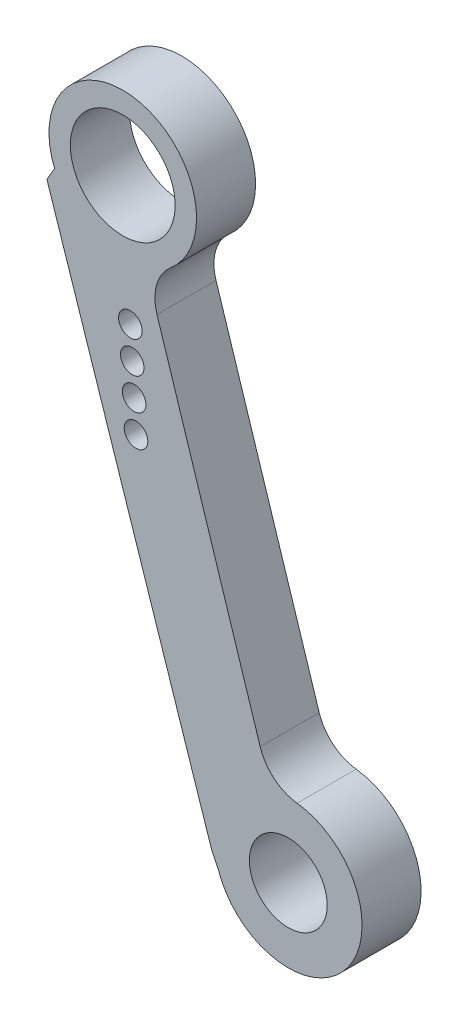
ISO-10303-21;
HEADER;
FILE_DESCRIPTION(('STEP AP214'),'2;1');
FILE_NAME('part.step','',(''),(''),'','','');
FILE_SCHEMA(('AUTOMOTIVE_DESIGN { 1 0 10303 214 1 1 1 1 }'));
ENDSEC;
DATA;
#1=APPLICATION_CONTEXT('core data for automotive mechanical design processes');
#2=APPLICATION_PROTOCOL_DEFINITION('international standard','automotive_design',2000,#1);
#3=PRODUCT_CONTEXT('',#1,'mechanical');
#4=PRODUCT('Part','Part','',(#3));
#5=PRODUCT_RELATED_PRODUCT_CATEGORY('part','',(#4));
#6=PRODUCT_DEFINITION_FORMATION('','',#4);
#7=PRODUCT_DEFINITION_CONTEXT('part definition',#1,'design');
#8=PRODUCT_DEFINITION('design','',#6,#7);
#9=PRODUCT_DEFINITION_SHAPE('','',#8);
#10=(LENGTH_UNIT() NAMED_UNIT(*) SI_UNIT(.MILLI.,.METRE.));
#11=(NAMED_UNIT(*) PLANE_ANGLE_UNIT() SI_UNIT($,.RADIAN.));
#12=(NAMED_UNIT(*) SI_UNIT($,.STERADIAN.) SOLID_ANGLE_UNIT());
#13=UNCERTAINTY_MEASURE_WITH_UNIT(LENGTH_MEASURE(1.E-05),#10,'distance_accuracy_value','');
#14=(GEOMETRIC_REPRESENTATION_CONTEXT(3) GLOBAL_UNCERTAINTY_ASSIGNED_CONTEXT((#13)) GLOBAL_UNIT_ASSIGNED_CONTEXT((#10,
#11,#12)) REPRESENTATION_CONTEXT('',''));
#15=CARTESIAN_POINT('',(0.,0.,0.));
#16=DIRECTION('',(0.,0.,1.));
#17=DIRECTION('',(1.,0.,0.));
#18=AXIS2_PLACEMENT_3D('',#15,#16,#17);
#19=CARTESIAN_POINT('',(8.97935143865251,86.4261615354982,0.));
#20=DIRECTION('',(0.,0.,1.));
#21=DIRECTION('',(1.,0.,0.));
#22=AXIS2_PLACEMENT_3D('',#19,#20,#21);
#23=CYLINDRICAL_SURFACE('',#22,4.99999999999999);
#24=CARTESIAN_POINT('',(8.97935143865251,86.4261615354982,4.));
#25=DIRECTION('',(0.,0.,1.));
#26=DIRECTION('',(1.,0.,0.));
#27=AXIS2_PLACEMENT_3D('',#24,#25,#26);
#28=CIRCLE('',#27,4.99999999999999);
#29=CARTESIAN_POINT('',(12.2155763988748,82.6147512969075,4.));
#30=VERTEX_POINT('',#29);
#31=CARTESIAN_POINT('',(4.36118664892974,84.5097706633208,4.));
#32=VERTEX_POINT('',#31);
#33=EDGE_CURVE('E130',#30,#32,#28,.T.);
#34=ORIENTED_EDGE('',*,*,#33,.F.);
#35=DIRECTION('',(0.,0.,1.));
#36=VECTOR('',#35,1.);
#37=CARTESIAN_POINT('',(12.2155763988748,82.6147512969075,0.));
#38=LINE('',#37,#36);
#39=CARTESIAN_POINT('',(12.2155763988748,82.6147512969075,0.));
#40=VERTEX_POINT('',#39);
#41=EDGE_CURVE('E11',#40,#30,#38,.T.);
#42=ORIENTED_EDGE('',*,*,#41,.F.);
#43=CARTESIAN_POINT('',(8.97935143865251,86.4261615354982,0.));
#44=DIRECTION('',(0.,0.,1.));
#45=DIRECTION('',(1.,0.,0.));
#46=AXIS2_PLACEMENT_3D('',#43,#44,#45);
#47=CIRCLE('',#46,4.99999999999999);
#48=CARTESIAN_POINT('',(4.36118664892974,84.5097706633208,0.));
#49=VERTEX_POINT('',#48);
#50=EDGE_CURVE('E151',#40,#49,#47,.T.);
#51=ORIENTED_EDGE('',*,*,#50,.T.);
#52=DIRECTION('',(0.,0.,1.));
#53=VECTOR('',#52,1.);
#54=CARTESIAN_POINT('',(4.36118664892974,84.5097706633208,0.));
#55=LINE('',#54,#53);
#56=EDGE_CURVE('E36',#49,#32,#55,.T.);
#57=ORIENTED_EDGE('',*,*,#56,.T.);
#58=EDGE_LOOP('',(#34,#42,#51,#57));
#59=FACE_BOUND('',#58,.T.);
#60=ADVANCED_FACE('F33',(#59),#23,.T.);
#61=CARTESIAN_POINT('',(14.1573113750082,80.3279051537531,0.));
#62=DIRECTION('',(0.,0.,1.));
#63=DIRECTION('',(1.,0.,0.));
#64=AXIS2_PLACEMENT_3D('',#61,#62,#63);
#65=CYLINDRICAL_SURFACE('',#64,3.00000000000001);
#66=CARTESIAN_POINT('',(14.1573113750082,80.3279051537531,4.));
#67=DIRECTION('',(0.,0.,-1.));
#68=DIRECTION('',(-1.,0.,0.));
#69=AXIS2_PLACEMENT_3D('',#66,#67,#68);
#70=CIRCLE('',#69,3.00000000000001);
#71=CARTESIAN_POINT('',(11.2998254082475,79.4142455071855,4.));
#72=VERTEX_POINT('',#71);
#73=EDGE_CURVE('E149',#72,#30,#70,.T.);
#74=ORIENTED_EDGE('',*,*,#73,.F.);
#75=DIRECTION('',(0.,0.,1.));
#76=VECTOR('',#75,1.);
#77=CARTESIAN_POINT('',(11.2998254082475,79.4142455071855,0.));
#78=LINE('',#77,#76);
#79=CARTESIAN_POINT('',(11.2998254082475,79.4142455071855,0.));
#80=VERTEX_POINT('',#79);
#81=EDGE_CURVE('E42',#80,#72,#78,.T.);
#82=ORIENTED_EDGE('',*,*,#81,.F.);
#83=CARTESIAN_POINT('',(14.1573113750082,80.3279051537531,0.));
#84=DIRECTION('',(0.,0.,-1.));
#85=DIRECTION('',(-1.,0.,0.));
#86=AXIS2_PLACEMENT_3D('',#83,#84,#85);
#87=CIRCLE('',#86,3.00000000000001);
#88=EDGE_CURVE('E120',#80,#40,#87,.T.);
#89=ORIENTED_EDGE('',*,*,#88,.T.);
#90=ORIENTED_EDGE('',*,*,#41,.T.);
#91=EDGE_LOOP('',(#74,#82,#89,#90));
#92=FACE_BOUND('',#91,.T.);
#93=ADVANCED_FACE('F163',(#92),#65,.F.);
#94=CARTESIAN_POINT('',(18.2905128783694,57.5507524450491,0.));
#95=DIRECTION('',(0.952495322253555,0.304553215522505,0.));
#96=DIRECTION('',(-0.304553215522505,0.952495322253555,0.));
#97=AXIS2_PLACEMENT_3D('',#94,#95,#96);
#98=PLANE('',#97);
#99=DIRECTION('',(-0.304553215522505,0.952495322253555,0.));
#100=VECTOR('',#99,1.);
#101=CARTESIAN_POINT('',(18.2905128783694,57.5507524450491,4.));
#102=LINE('',#101,#100);
#103=CARTESIAN_POINT('',(18.2905128783694,57.5507524450491,4.));
#104=VERTEX_POINT('',#103);
#105=EDGE_CURVE('E107',#104,#72,#102,.T.);
#106=ORIENTED_EDGE('',*,*,#105,.F.);
#107=DIRECTION('',(0.,0.,1.));
#108=VECTOR('',#107,1.);
#109=CARTESIAN_POINT('',(18.2905128783694,57.5507524450491,0.));
#110=LINE('',#109,#108);
#111=CARTESIAN_POINT('',(18.2905128783694,57.5507524450491,0.));
#112=VERTEX_POINT('',#111);
#113=EDGE_CURVE('E102',#112,#104,#110,.T.);
#114=ORIENTED_EDGE('',*,*,#113,.F.);
#115=DIRECTION('',(-0.304553215522505,0.952495322253555,0.));
#116=VECTOR('',#115,1.);
#117=CARTESIAN_POINT('',(18.2905128783694,57.5507524450491,0.));
#118=LINE('',#117,#116);
#119=EDGE_CURVE('E105',#112,#80,#118,.T.);
#120=ORIENTED_EDGE('',*,*,#119,.T.);
#121=ORIENTED_EDGE('',*,*,#81,.T.);
#122=EDGE_LOOP('',(#106,#114,#120,#121));
#123=FACE_BOUND('',#122,.T.);
#124=ADVANCED_FACE('F104',(#123),#98,.T.);
#125=CARTESIAN_POINT('',(21.1479988451301,58.4644120916165,0.));
#126=DIRECTION('',(0.,0.,1.));
#127=DIRECTION('',(1.,0.,0.));
#128=AXIS2_PLACEMENT_3D('',#125,#126,#127);
#129=CYLINDRICAL_SURFACE('',#128,3.00000000000005);
#130=CARTESIAN_POINT('',(21.1479988451301,58.4644120916165,4.));
#131=DIRECTION('',(0.,0.,-1.));
#132=DIRECTION('',(-1.,0.,0.));
#133=AXIS2_PLACEMENT_3D('',#130,#131,#132);
#134=CIRCLE('',#133,3.00000000000005);
#135=CARTESIAN_POINT('',(20.7904727789463,55.4857924260669,4.));
#136=VERTEX_POINT('',#135);
#137=EDGE_CURVE('E146',#136,#104,#134,.T.);
#138=ORIENTED_EDGE('',*,*,#137,.F.);
#139=DIRECTION('',(0.,0.,1.));
#140=VECTOR('',#139,1.);
#141=CARTESIAN_POINT('',(20.7904727789463,55.4857924260669,0.));
#142=LINE('',#141,#140);
#143=CARTESIAN_POINT('',(20.7904727789463,55.4857924260669,0.));
#144=VERTEX_POINT('',#143);
#145=EDGE_CURVE('E112',#144,#136,#142,.T.);
#146=ORIENTED_EDGE('',*,*,#145,.F.);
#147=CARTESIAN_POINT('',(21.1479988451301,58.4644120916165,0.));
#148=DIRECTION('',(0.,0.,-1.));
#149=DIRECTION('',(-1.,0.,0.));
#150=AXIS2_PLACEMENT_3D('',#147,#148,#149);
#151=CIRCLE('',#150,3.00000000000005);
#152=EDGE_CURVE('E118',#144,#112,#151,.T.);
#153=ORIENTED_EDGE('',*,*,#152,.T.);
#154=ORIENTED_EDGE('',*,*,#113,.T.);
#155=EDGE_LOOP('',(#138,#146,#153,#154));
#156=FACE_BOUND('',#155,.T.);
#157=ADVANCED_FACE('F122',(#156),#129,.F.);
#158=CARTESIAN_POINT('',(20.1945960019734,50.5214263168174,0.));
#159=DIRECTION('',(0.,0.,1.));
#160=DIRECTION('',(1.,0.,0.));
#161=AXIS2_PLACEMENT_3D('',#158,#159,#160);
#162=CYLINDRICAL_SURFACE('',#161,4.99999999999999);
#163=CARTESIAN_POINT('',(20.1945960019734,50.5214263168174,4.));
#164=DIRECTION('',(0.,0.,1.));
#165=DIRECTION('',(1.,0.,0.));
#166=AXIS2_PLACEMENT_3D('',#163,#164,#165);
#167=CIRCLE('',#166,4.99999999999999);
#168=CARTESIAN_POINT('',(15.4550916296435,48.9285991747001,4.));
#169=VERTEX_POINT('',#168);
#170=EDGE_CURVE('E143',#169,#136,#167,.T.);
#171=ORIENTED_EDGE('',*,*,#170,.F.);
#172=DIRECTION('',(0.,0.,1.));
#173=VECTOR('',#172,1.);
#174=CARTESIAN_POINT('',(15.4550916296435,48.9285991747001,0.));
#175=LINE('',#174,#173);
#176=CARTESIAN_POINT('',(15.4550916296435,48.9285991747001,0.));
#177=VERTEX_POINT('',#176);
#178=EDGE_CURVE('E155',#177,#169,#175,.T.);
#179=ORIENTED_EDGE('',*,*,#178,.F.);
#180=CARTESIAN_POINT('',(20.1945960019734,50.5214263168174,0.));
#181=DIRECTION('',(0.,0.,1.));
#182=DIRECTION('',(1.,0.,0.));
#183=AXIS2_PLACEMENT_3D('',#180,#181,#182);
#184=CIRCLE('',#183,4.99999999999999);
#185=EDGE_CURVE('E123',#177,#144,#184,.T.);
#186=ORIENTED_EDGE('',*,*,#185,.T.);
#187=ORIENTED_EDGE('',*,*,#145,.T.);
#188=EDGE_LOOP('',(#171,#179,#186,#187));
#189=FACE_BOUND('',#188,.T.);
#190=ADVANCED_FACE('F176',(#189),#162,.T.);
#191=CARTESIAN_POINT('',(15.0110533623116,49.8306623749407,0.));
#192=DIRECTION('',(-0.897192109571416,-0.441640485602025,0.));
#193=DIRECTION('',(0.441640485602025,-0.897192109571416,0.));
#194=AXIS2_PLACEMENT_3D('',#191,#192,#193);
#195=PLANE('',#194);
#196=DIRECTION('',(0.441640485602025,-0.897192109571416,0.));
#197=VECTOR('',#196,1.);
#198=CARTESIAN_POINT('',(15.0110533623116,49.8306623749407,4.));
#199=LINE('',#198,#197);
#200=CARTESIAN_POINT('',(15.0110533623116,49.8306623749407,4.));
#201=VERTEX_POINT('',#200);
#202=EDGE_CURVE('E140',#201,#169,#199,.T.);
#203=ORIENTED_EDGE('',*,*,#202,.F.);
#204=DIRECTION('',(0.,0.,1.));
#205=VECTOR('',#204,1.);
#206=CARTESIAN_POINT('',(15.0110533623116,49.8306623749407,0.));
#207=LINE('',#206,#205);
#208=CARTESIAN_POINT('',(15.0110533623116,49.8306623749407,0.));
#209=VERTEX_POINT('',#208);
#210=EDGE_CURVE('E157',#209,#201,#207,.T.);
#211=ORIENTED_EDGE('',*,*,#210,.F.);
#212=DIRECTION('',(0.441640485602025,-0.897192109571416,0.));
#213=VECTOR('',#212,1.);
#214=CARTESIAN_POINT('',(15.0110533623116,49.8306623749407,0.));
#215=LINE('',#214,#213);
#216=EDGE_CURVE('E125',#209,#177,#215,.T.);
#217=ORIENTED_EDGE('',*,*,#216,.T.);
#218=ORIENTED_EDGE('',*,*,#178,.T.);
#219=EDGE_LOOP('',(#203,#211,#217,#218));
#220=FACE_BOUND('',#219,.T.);
#221=ADVANCED_FACE('F179',(#220),#195,.T.);
#222=CARTESIAN_POINT('',(3.83869237847881,83.6229018224323,0.));
#223=DIRECTION('',(-0.949453564490203,-0.313907516438917,0.));
#224=DIRECTION('',(0.313907516438917,-0.949453564490203,0.));
#225=AXIS2_PLACEMENT_3D('',#222,#223,#224);
#226=PLANE('',#225);
#227=DIRECTION('',(0.313907516438916,-0.949453564490203,0.));
#228=VECTOR('',#227,1.);
#229=CARTESIAN_POINT('',(3.83869237847881,83.6229018224323,4.));
#230=LINE('',#229,#228);
#231=CARTESIAN_POINT('',(3.83869237847881,83.6229018224323,4.));
#232=VERTEX_POINT('',#231);
#233=EDGE_CURVE('E137',#232,#201,#230,.T.);
#234=ORIENTED_EDGE('',*,*,#233,.F.);
#235=DIRECTION('',(0.,0.,1.));
#236=VECTOR('',#235,1.);
#237=CARTESIAN_POINT('',(3.83869237847881,83.6229018224323,0.));
#238=LINE('',#237,#236);
#239=CARTESIAN_POINT('',(3.83869237847881,83.6229018224323,0.));
#240=VERTEX_POINT('',#239);
#241=EDGE_CURVE('E158',#240,#232,#238,.T.);
#242=ORIENTED_EDGE('',*,*,#241,.F.);
#243=DIRECTION('',(0.313907516438916,-0.949453564490203,0.));
#244=VECTOR('',#243,1.);
#245=CARTESIAN_POINT('',(3.83869237847881,83.6229018224323,0.));
#246=LINE('',#245,#244);
#247=EDGE_CURVE('E265',#240,#209,#246,.T.);
#248=ORIENTED_EDGE('',*,*,#247,.T.);
#249=ORIENTED_EDGE('',*,*,#210,.T.);
#250=EDGE_LOOP('',(#234,#242,#248,#249));
#251=FACE_BOUND('',#250,.T.);
#252=ADVANCED_FACE('F183',(#251),#226,.T.);
#253=CARTESIAN_POINT('',(4.36118664892974,84.5097706633208,0.));
#254=DIRECTION('',(-0.861591516947736,0.507602263513176,0.));
#255=DIRECTION('',(-0.507602263513176,-0.861591516947736,0.));
#256=AXIS2_PLACEMENT_3D('',#253,#254,#255);
#257=PLANE('',#256);
#258=DIRECTION('',(-0.507602263513176,-0.861591516947736,0.));
#259=VECTOR('',#258,1.);
#260=CARTESIAN_POINT('',(4.36118664892974,84.5097706633208,4.));
#261=LINE('',#260,#259);
#262=EDGE_CURVE('E133',#32,#232,#261,.T.);
#263=ORIENTED_EDGE('',*,*,#262,.F.);
#264=ORIENTED_EDGE('',*,*,#56,.F.);
#265=DIRECTION('',(-0.507602263513176,-0.861591516947736,0.));
#266=VECTOR('',#265,1.);
#267=CARTESIAN_POINT('',(4.36118664892974,84.5097706633208,0.));
#268=LINE('',#267,#266);
#269=EDGE_CURVE('E263',#49,#240,#268,.T.);
#270=ORIENTED_EDGE('',*,*,#269,.T.);
#271=ORIENTED_EDGE('',*,*,#241,.T.);
#272=EDGE_LOOP('',(#263,#264,#270,#271));
#273=FACE_BOUND('',#272,.T.);
#274=ADVANCED_FACE('F160',(#273),#257,.T.);
#275=CARTESIAN_POINT('',(8.97935143865251,86.4261615354982,0.));
#276=DIRECTION('',(0.,0.,1.));
#277=DIRECTION('',(1.,0.,0.));
#278=AXIS2_PLACEMENT_3D('',#275,#276,#277);
#279=PLANE('',#278);
#280=CARTESIAN_POINT('',(9.87607362016182,71.6533524143748,0.));
#281=DIRECTION('',(0.,0.,1.));
#282=DIRECTION('',(-1.,0.,0.));
#283=AXIS2_PLACEMENT_3D('',#280,#281,#282);
#284=CIRCLE('',#283,0.799999999999999);
#285=CARTESIAN_POINT('',(9.07607362016183,71.6533524143748,0.));
#286=VERTEX_POINT('',#285);
#287=EDGE_CURVE('E226',#286,#286,#284,.T.);
#288=ORIENTED_EDGE('',*,*,#287,.T.);
#289=EDGE_LOOP('',(#288));
#290=FACE_BOUND('',#289,.T.);
#291=CARTESIAN_POINT('',(9.74883601332579,73.749494249129,0.));
#292=DIRECTION('',(0.,0.,1.));
#293=DIRECTION('',(-1.,0.,0.));
#294=AXIS2_PLACEMENT_3D('',#291,#292,#293);
#295=CIRCLE('',#294,0.799999999999999);
#296=CARTESIAN_POINT('',(8.9488360133258,73.749494249129,0.));
#297=VERTEX_POINT('',#296);
#298=EDGE_CURVE('E234',#297,#297,#295,.T.);
#299=ORIENTED_EDGE('',*,*,#298,.T.);
#300=EDGE_LOOP('',(#299));
#301=FACE_BOUND('',#300,.T.);
#302=CARTESIAN_POINT('',(9.62159840648976,75.8456360838832,0.));
#303=DIRECTION('',(0.,0.,1.));
#304=DIRECTION('',(-1.,0.,0.));
#305=AXIS2_PLACEMENT_3D('',#302,#303,#304);
#306=CIRCLE('',#305,0.799999999999999);
#307=CARTESIAN_POINT('',(8.82159840648977,75.8456360838832,0.));
#308=VERTEX_POINT('',#307);
#309=EDGE_CURVE('E240',#308,#308,#306,.T.);
#310=ORIENTED_EDGE('',*,*,#309,.T.);
#311=EDGE_LOOP('',(#310));
#312=FACE_BOUND('',#311,.T.);
#313=CARTESIAN_POINT('',(9.49436079965373,77.9417779186374,0.));
#314=DIRECTION('',(0.,0.,1.));
#315=DIRECTION('',(-1.,0.,0.));
#316=AXIS2_PLACEMENT_3D('',#313,#314,#315);
#317=CIRCLE('',#316,0.799999999999999);
#318=CARTESIAN_POINT('',(8.69436079965373,77.9417779186374,0.));
#319=VERTEX_POINT('',#318);
#320=EDGE_CURVE('E246',#319,#319,#317,.T.);
#321=ORIENTED_EDGE('',*,*,#320,.T.);
#322=EDGE_LOOP('',(#321));
#323=FACE_BOUND('',#322,.T.);
#324=CARTESIAN_POINT('',(8.97935143865251,86.4261615354982,0.));
#325=DIRECTION('',(0.,0.,1.));
#326=DIRECTION('',(-1.,0.,0.));
#327=AXIS2_PLACEMENT_3D('',#324,#325,#326);
#328=CIRCLE('',#327,3.55000000000047);
#329=CARTESIAN_POINT('',(5.42935143865203,86.4261615354982,0.));
#330=VERTEX_POINT('',#329);
#331=EDGE_CURVE('E252',#330,#330,#328,.T.);
#332=ORIENTED_EDGE('',*,*,#331,.T.);
#333=EDGE_LOOP('',(#332));
#334=FACE_BOUND('',#333,.T.);
#335=CARTESIAN_POINT('',(20.1945960019734,50.5214263168174,0.));
#336=DIRECTION('',(0.,0.,1.));
#337=DIRECTION('',(-1.,0.,0.));
#338=AXIS2_PLACEMENT_3D('',#335,#336,#337);
#339=CIRCLE('',#338,2.6375);
#340=CARTESIAN_POINT('',(17.5570960019734,50.5214263168174,0.));
#341=VERTEX_POINT('',#340);
#342=EDGE_CURVE('E134',#341,#341,#339,.T.);
#343=ORIENTED_EDGE('',*,*,#342,.T.);
#344=EDGE_LOOP('',(#343));
#345=FACE_BOUND('',#344,.T.);
#346=ORIENTED_EDGE('',*,*,#50,.F.);
#347=ORIENTED_EDGE('',*,*,#88,.F.);
#348=ORIENTED_EDGE('',*,*,#119,.F.);
#349=ORIENTED_EDGE('',*,*,#152,.F.);
#350=ORIENTED_EDGE('',*,*,#185,.F.);
#351=ORIENTED_EDGE('',*,*,#216,.F.);
#352=ORIENTED_EDGE('',*,*,#247,.F.);
#353=ORIENTED_EDGE('',*,*,#269,.F.);
#354=EDGE_LOOP('',(#346,#347,#348,#349,#350,#351,#352,#353));
#355=FACE_BOUND('',#354,.T.);
#356=ADVANCED_FACE('F116',(#290,#301,#312,#323,#334,#345,#355),#279,.F.);
#357=CARTESIAN_POINT('',(8.97935143865251,86.4261615354982,4.));
#358=DIRECTION('',(0.,0.,1.));
#359=DIRECTION('',(1.,0.,0.));
#360=AXIS2_PLACEMENT_3D('',#357,#358,#359);
#361=PLANE('',#360);
#362=CARTESIAN_POINT('',(9.87607362016182,71.6533524143748,4.));
#363=DIRECTION('',(0.,0.,1.));
#364=DIRECTION('',(-1.,0.,0.));
#365=AXIS2_PLACEMENT_3D('',#362,#363,#364);
#366=CIRCLE('',#365,0.799999999999999);
#367=CARTESIAN_POINT('',(9.07607362016183,71.6533524143748,4.));
#368=VERTEX_POINT('',#367);
#369=EDGE_CURVE('E229',#368,#368,#366,.T.);
#370=ORIENTED_EDGE('',*,*,#369,.F.);
#371=EDGE_LOOP('',(#370));
#372=FACE_BOUND('',#371,.T.);
#373=CARTESIAN_POINT('',(9.74883601332579,73.749494249129,4.));
#374=DIRECTION('',(0.,0.,1.));
#375=DIRECTION('',(-1.,0.,0.));
#376=AXIS2_PLACEMENT_3D('',#373,#374,#375);
#377=CIRCLE('',#376,0.799999999999999);
#378=CARTESIAN_POINT('',(8.9488360133258,73.749494249129,4.));
#379=VERTEX_POINT('',#378);
#380=EDGE_CURVE('E231',#379,#379,#377,.T.);
#381=ORIENTED_EDGE('',*,*,#380,.F.);
#382=EDGE_LOOP('',(#381));
#383=FACE_BOUND('',#382,.T.);
#384=CARTESIAN_POINT('',(9.62159840648976,75.8456360838832,4.));
#385=DIRECTION('',(0.,0.,1.));
#386=DIRECTION('',(-1.,0.,0.));
#387=AXIS2_PLACEMENT_3D('',#384,#385,#386);
#388=CIRCLE('',#387,0.799999999999999);
#389=CARTESIAN_POINT('',(8.82159840648977,75.8456360838832,4.));
#390=VERTEX_POINT('',#389);
#391=EDGE_CURVE('E237',#390,#390,#388,.T.);
#392=ORIENTED_EDGE('',*,*,#391,.F.);
#393=EDGE_LOOP('',(#392));
#394=FACE_BOUND('',#393,.T.);
#395=CARTESIAN_POINT('',(9.49436079965373,77.9417779186374,4.));
#396=DIRECTION('',(0.,0.,1.));
#397=DIRECTION('',(-1.,0.,0.));
#398=AXIS2_PLACEMENT_3D('',#395,#396,#397);
#399=CIRCLE('',#398,0.799999999999999);
#400=CARTESIAN_POINT('',(8.69436079965373,77.9417779186374,4.));
#401=VERTEX_POINT('',#400);
#402=EDGE_CURVE('E243',#401,#401,#399,.T.);
#403=ORIENTED_EDGE('',*,*,#402,.F.);
#404=EDGE_LOOP('',(#403));
#405=FACE_BOUND('',#404,.T.);
#406=CARTESIAN_POINT('',(8.97935143865251,86.4261615354982,4.));
#407=DIRECTION('',(0.,0.,1.));
#408=DIRECTION('',(-1.,0.,0.));
#409=AXIS2_PLACEMENT_3D('',#406,#407,#408);
#410=CIRCLE('',#409,3.55000000000047);
#411=CARTESIAN_POINT('',(5.42935143865203,86.4261615354982,4.));
#412=VERTEX_POINT('',#411);
#413=EDGE_CURVE('E249',#412,#412,#410,.T.);
#414=ORIENTED_EDGE('',*,*,#413,.F.);
#415=EDGE_LOOP('',(#414));
#416=FACE_BOUND('',#415,.T.);
#417=CARTESIAN_POINT('',(20.1945960019734,50.5214263168174,4.));
#418=DIRECTION('',(0.,0.,1.));
#419=DIRECTION('',(-1.,0.,0.));
#420=AXIS2_PLACEMENT_3D('',#417,#418,#419);
#421=CIRCLE('',#420,2.6375);
#422=CARTESIAN_POINT('',(17.5570960019734,50.5214263168174,4.));
#423=VERTEX_POINT('',#422);
#424=EDGE_CURVE('E255',#423,#423,#421,.T.);
#425=ORIENTED_EDGE('',*,*,#424,.F.);
#426=EDGE_LOOP('',(#425));
#427=FACE_BOUND('',#426,.T.);
#428=ORIENTED_EDGE('',*,*,#33,.T.);
#429=ORIENTED_EDGE('',*,*,#262,.T.);
#430=ORIENTED_EDGE('',*,*,#233,.T.);
#431=ORIENTED_EDGE('',*,*,#202,.T.);
#432=ORIENTED_EDGE('',*,*,#170,.T.);
#433=ORIENTED_EDGE('',*,*,#137,.T.);
#434=ORIENTED_EDGE('',*,*,#105,.T.);
#435=ORIENTED_EDGE('',*,*,#73,.T.);
#436=EDGE_LOOP('',(#428,#429,#430,#431,#432,#433,#434,#435));
#437=FACE_BOUND('',#436,.T.);
#438=ADVANCED_FACE('F162',(#372,#383,#394,#405,#416,#427,#437),#361,.T.);
#439=CARTESIAN_POINT('',(20.1945960019734,50.5214263168174,0.));
#440=DIRECTION('',(0.,0.,1.));
#441=DIRECTION('',(1.,0.,0.));
#442=AXIS2_PLACEMENT_3D('',#439,#440,#441);
#443=CYLINDRICAL_SURFACE('',#442,2.6375);
#444=ORIENTED_EDGE('',*,*,#342,.F.);
#445=EDGE_LOOP('',(#444));
#446=FACE_BOUND('',#445,.T.);
#447=ORIENTED_EDGE('',*,*,#424,.T.);
#448=EDGE_LOOP('',(#447));
#449=FACE_BOUND('',#448,.T.);
#450=ADVANCED_FACE('F195',(#446,#449),#443,.F.);
#451=CARTESIAN_POINT('',(8.97935143865251,86.4261615354982,0.));
#452=DIRECTION('',(0.,0.,1.));
#453=DIRECTION('',(1.,0.,0.));
#454=AXIS2_PLACEMENT_3D('',#451,#452,#453);
#455=CYLINDRICAL_SURFACE('',#454,3.55000000000047);
#456=ORIENTED_EDGE('',*,*,#331,.F.);
#457=EDGE_LOOP('',(#456));
#458=FACE_BOUND('',#457,.T.);
#459=ORIENTED_EDGE('',*,*,#413,.T.);
#460=EDGE_LOOP('',(#459));
#461=FACE_BOUND('',#460,.T.);
#462=ADVANCED_FACE('F202',(#458,#461),#455,.F.);
#463=CARTESIAN_POINT('',(9.49436079965373,77.9417779186374,0.));
#464=DIRECTION('',(0.,0.,1.));
#465=DIRECTION('',(1.,0.,0.));
#466=AXIS2_PLACEMENT_3D('',#463,#464,#465);
#467=CYLINDRICAL_SURFACE('',#466,0.799999999999999);
#468=ORIENTED_EDGE('',*,*,#320,.F.);
#469=EDGE_LOOP('',(#468));
#470=FACE_BOUND('',#469,.T.);
#471=ORIENTED_EDGE('',*,*,#402,.T.);
#472=EDGE_LOOP('',(#471));
#473=FACE_BOUND('',#472,.T.);
#474=ADVANCED_FACE('F206',(#470,#473),#467,.F.);
#475=CARTESIAN_POINT('',(9.62159840648976,75.8456360838832,0.));
#476=DIRECTION('',(0.,0.,1.));
#477=DIRECTION('',(1.,0.,0.));
#478=AXIS2_PLACEMENT_3D('',#475,#476,#477);
#479=CYLINDRICAL_SURFACE('',#478,0.799999999999999);
#480=ORIENTED_EDGE('',*,*,#309,.F.);
#481=EDGE_LOOP('',(#480));
#482=FACE_BOUND('',#481,.T.);
#483=ORIENTED_EDGE('',*,*,#391,.T.);
#484=EDGE_LOOP('',(#483));
#485=FACE_BOUND('',#484,.T.);
#486=ADVANCED_FACE('F210',(#482,#485),#479,.F.);
#487=CARTESIAN_POINT('',(9.74883601332579,73.749494249129,0.));
#488=DIRECTION('',(0.,0.,1.));
#489=DIRECTION('',(1.,0.,0.));
#490=AXIS2_PLACEMENT_3D('',#487,#488,#489);
#491=CYLINDRICAL_SURFACE('',#490,0.799999999999999);
#492=ORIENTED_EDGE('',*,*,#298,.F.);
#493=EDGE_LOOP('',(#492));
#494=FACE_BOUND('',#493,.T.);
#495=ORIENTED_EDGE('',*,*,#380,.T.);
#496=EDGE_LOOP('',(#495));
#497=FACE_BOUND('',#496,.T.);
#498=ADVANCED_FACE('F214',(#494,#497),#491,.F.);
#499=CARTESIAN_POINT('',(9.87607362016182,71.6533524143748,0.));
#500=DIRECTION('',(0.,0.,1.));
#501=DIRECTION('',(1.,0.,0.));
#502=AXIS2_PLACEMENT_3D('',#499,#500,#501);
#503=CYLINDRICAL_SURFACE('',#502,0.799999999999999);
#504=ORIENTED_EDGE('',*,*,#287,.F.);
#505=EDGE_LOOP('',(#504));
#506=FACE_BOUND('',#505,.T.);
#507=ORIENTED_EDGE('',*,*,#369,.T.);
#508=EDGE_LOOP('',(#507));
#509=FACE_BOUND('',#508,.T.);
#510=ADVANCED_FACE('F218',(#506,#509),#503,.F.);
#511=CLOSED_SHELL('',(#60,#93,#124,#157,#190,#221,#252,#274,#356,#438,#450,#462,#474,#486,#498,#510));
#512=MANIFOLD_SOLID_BREP('B2',#511);
#513=ADVANCED_BREP_SHAPE_REPRESENTATION('',(#18,#512),#14);
#514=SHAPE_DEFINITION_REPRESENTATION(#9,#513);
ENDSEC;
END-ISO-10303-21;
